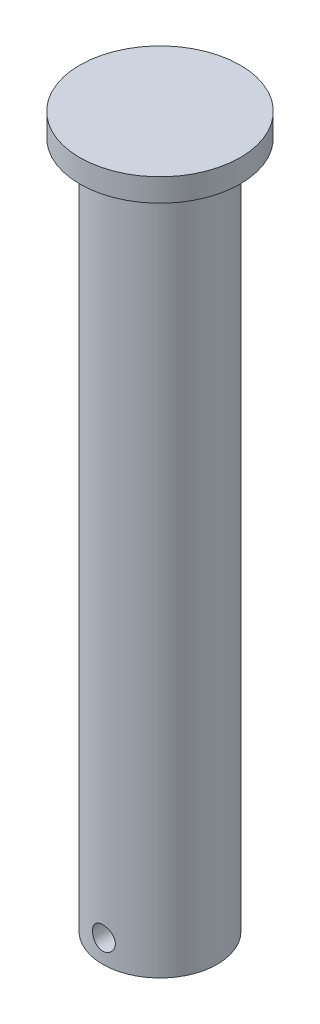
ISO-10303-21;
HEADER;
FILE_DESCRIPTION(('STEP AP214'),'2;1');
FILE_NAME('part.step','',(''),(''),'','','');
FILE_SCHEMA(('AUTOMOTIVE_DESIGN { 1 0 10303 214 1 1 1 1 }'));
ENDSEC;
DATA;
#1=APPLICATION_CONTEXT('core data for automotive mechanical design processes');
#2=APPLICATION_PROTOCOL_DEFINITION('international standard','automotive_design',2000,#1);
#3=PRODUCT_CONTEXT('',#1,'mechanical');
#4=PRODUCT('Part','Part','',(#3));
#5=PRODUCT_RELATED_PRODUCT_CATEGORY('part','',(#4));
#6=PRODUCT_DEFINITION_FORMATION('','',#4);
#7=PRODUCT_DEFINITION_CONTEXT('part definition',#1,'design');
#8=PRODUCT_DEFINITION('design','',#6,#7);
#9=PRODUCT_DEFINITION_SHAPE('','',#8);
#10=(LENGTH_UNIT() NAMED_UNIT(*) SI_UNIT(.MILLI.,.METRE.));
#11=(NAMED_UNIT(*) PLANE_ANGLE_UNIT() SI_UNIT($,.RADIAN.));
#12=(NAMED_UNIT(*) SI_UNIT($,.STERADIAN.) SOLID_ANGLE_UNIT());
#13=UNCERTAINTY_MEASURE_WITH_UNIT(LENGTH_MEASURE(1.E-05),#10,'distance_accuracy_value','');
#14=(GEOMETRIC_REPRESENTATION_CONTEXT(3) GLOBAL_UNCERTAINTY_ASSIGNED_CONTEXT((#13)) GLOBAL_UNIT_ASSIGNED_CONTEXT((#10,
#11,#12)) REPRESENTATION_CONTEXT('',''));
#15=CARTESIAN_POINT('',(0.,0.,0.));
#16=DIRECTION('',(0.,0.,1.));
#17=DIRECTION('',(1.,0.,0.));
#18=AXIS2_PLACEMENT_3D('',#15,#16,#17);
#19=CARTESIAN_POINT('',(0.,60.,0.));
#20=DIRECTION('',(0.,-1.,0.));
#21=DIRECTION('',(0.,0.,-1.));
#22=AXIS2_PLACEMENT_3D('',#19,#20,#21);
#23=CYLINDRICAL_SURFACE('',#22,5.);
#24=CARTESIAN_POINT('',(1.,2.,-4.89897948556636));
#25=CARTESIAN_POINT('',(0.999997945876045,1.94443562451802,-4.89898059043933));
#26=CARTESIAN_POINT('',(0.995353171723656,1.88884537669351,-4.89993508346913));
#27=CARTESIAN_POINT('',(0.976912283588335,1.77923749488159,-4.90364431385263));
#28=CARTESIAN_POINT('',(0.963108847071181,1.72522115536893,-4.90640049166333));
#29=CARTESIAN_POINT('',(0.926795782617738,1.62036269663707,-4.91338873700356));
#30=CARTESIAN_POINT('',(0.904294814152083,1.56951747846507,-4.91761933615313));
#31=CARTESIAN_POINT('',(0.851249107671043,1.47232515530538,-4.92707799486421));
#32=CARTESIAN_POINT('',(0.820704818601296,1.42597779946273,-4.93230599875014));
#33=CARTESIAN_POINT('',(0.75197907565329,1.3384389961455,-4.9432529969268));
#34=CARTESIAN_POINT('',(0.713705655913279,1.29732041211586,-4.94897737836825));
#35=CARTESIAN_POINT('',(0.63080678902135,1.22204246642119,-4.9602247230302));
#36=CARTESIAN_POINT('',(0.586180896977995,1.18788359258285,-4.96574767210945));
#37=CARTESIAN_POINT('',(0.491361355924245,1.12721198237149,-4.97602796417448));
#38=CARTESIAN_POINT('',(0.441122567672207,1.10076848618335,-4.9807782144152));
#39=CARTESIAN_POINT('',(0.336804150387274,1.05672506295188,-4.98891736883662));
#40=CARTESIAN_POINT('',(0.282724881420554,1.03912430809901,-4.99230640044127));
#41=CARTESIAN_POINT('',(0.173016773278494,1.01349280638037,-4.9973032068841));
#42=CARTESIAN_POINT('',(0.117417739214814,1.00533902242899,-4.99893386288125));
#43=CARTESIAN_POINT('',(0.00561856843753665,0.998449048161686,-5.00030921183606));
#44=CARTESIAN_POINT('',(-0.0505815098318429,0.999711950354179,-5.0000540865276));
#45=CARTESIAN_POINT('',(-0.161142000743589,1.01152618021555,-4.99770434868515));
#46=CARTESIAN_POINT('',(-0.21551721429847,1.02194497716785,-4.99563598365838));
#47=CARTESIAN_POINT('',(-0.321731626580301,1.05156503245889,-4.98992177159409));
#48=CARTESIAN_POINT('',(-0.373570723747129,1.07076664219187,-4.98627586144039));
#49=CARTESIAN_POINT('',(-0.473619463200887,1.11753004014727,-4.97777296019958));
#50=CARTESIAN_POINT('',(-0.5218041741339,1.14514375110489,-4.97290848175224));
#51=CARTESIAN_POINT('',(-0.612905045859756,1.2079090772366,-4.96250469473785));
#52=CARTESIAN_POINT('',(-0.655820599525001,1.24306155977052,-4.95696530855222));
#53=CARTESIAN_POINT('',(-0.735951431053457,1.32063362210847,-4.9457096436446));
#54=CARTESIAN_POINT('',(-0.773054316573631,1.36316918672959,-4.93999196457516));
#55=CARTESIAN_POINT('',(-0.839618493176807,1.45391644245075,-4.92911571598761));
#56=CARTESIAN_POINT('',(-0.86907963972775,1.5021282408832,-4.92395715704548));
#57=CARTESIAN_POINT('',(-0.919562814801881,1.60302083182181,-4.91478047472924));
#58=CARTESIAN_POINT('',(-0.940566647777709,1.65571096763966,-4.91076481563549));
#59=CARTESIAN_POINT('',(-0.973390341627582,1.76397132372399,-4.90436476321273));
#60=CARTESIAN_POINT('',(-0.985211399456642,1.81954116761908,-4.90198015728428));
#61=CARTESIAN_POINT('',(-0.999166006036051,1.93096485799904,-4.89915479267828));
#62=CARTESIAN_POINT('',(-1.00146185889791,1.98679757431034,-4.89868147057154));
#63=CARTESIAN_POINT('',(-0.996737628310738,2.09804822319968,-4.89964485688854));
#64=CARTESIAN_POINT('',(-0.989718073122442,2.15346617911886,-4.90108145700388));
#65=CARTESIAN_POINT('',(-0.966702208074157,2.26176864029224,-4.90567232494915));
#66=CARTESIAN_POINT('',(-0.950792620839298,2.31467234303576,-4.90880999014497));
#67=CARTESIAN_POINT('',(-0.910541035308518,2.41706327902874,-4.91643489351665));
#68=CARTESIAN_POINT('',(-0.886198342373177,2.46655023043572,-4.9209222428627));
#69=CARTESIAN_POINT('',(-0.829404142215598,2.56141310995016,-4.93081405962039));
#70=CARTESIAN_POINT('',(-0.796851077982754,2.60672704630083,-4.93622971864903));
#71=CARTESIAN_POINT('',(-0.724695572212712,2.69130831200092,-4.94733723826637));
#72=CARTESIAN_POINT('',(-0.685092405144537,2.73057501824925,-4.95302912723818));
#73=CARTESIAN_POINT('',(-0.599232273497891,2.80256255918558,-4.96415345869216));
#74=CARTESIAN_POINT('',(-0.55288249892963,2.83517365465,-4.96958057708684));
#75=CARTESIAN_POINT('',(-0.455267896634755,2.89214588149958,-4.9794712762862));
#76=CARTESIAN_POINT('',(-0.404003275433507,2.91650735934478,-4.98393489755211));
#77=CARTESIAN_POINT('',(-0.298302680824013,2.95612887174663,-4.99137294061067));
#78=CARTESIAN_POINT('',(-0.243886673478077,2.97144051822625,-4.99435579142604));
#79=CARTESIAN_POINT('',(-0.133189454679912,2.99269124766385,-4.9985323593766));
#80=CARTESIAN_POINT('',(-0.0769084687112141,2.99863145947568,-4.99972629199843));
#81=CARTESIAN_POINT('',(0.0348728939036234,3.00092698096289,-5.00018540454121));
#82=CARTESIAN_POINT('',(0.0903698121415025,2.99744728045621,-4.99948378549351));
#83=CARTESIAN_POINT('',(0.199971031315642,2.98136604945219,-4.99630043560318));
#84=CARTESIAN_POINT('',(0.254075349753691,2.96876463365193,-4.99381872714351));
#85=CARTESIAN_POINT('',(0.359252749745096,2.93487100790836,-4.98735498365001));
#86=CARTESIAN_POINT('',(0.410332443240281,2.91359862186882,-4.98337637247912));
#87=CARTESIAN_POINT('',(0.508221220185953,2.8629877586691,-4.97434722123382));
#88=CARTESIAN_POINT('',(0.555029965767411,2.83364864409628,-4.96929659645878));
#89=CARTESIAN_POINT('',(0.643863890106357,2.76718061293792,-4.95857599157869));
#90=CARTESIAN_POINT('',(0.685799716116503,2.72993366361323,-4.95289733422142));
#91=CARTESIAN_POINT('',(0.762882617756846,2.64894975990423,-4.94161222903622));
#92=CARTESIAN_POINT('',(0.798028083202712,2.60521127053126,-4.93600579862875));
#93=CARTESIAN_POINT('',(0.8608922194552,2.51192068329982,-4.92543342749964));
#94=CARTESIAN_POINT('',(0.888526814639767,2.46231103883963,-4.92047503631328));
#95=CARTESIAN_POINT('',(0.935024049287808,2.35906722670031,-4.91185237184445));
#96=CARTESIAN_POINT('',(0.95389464597929,2.30543676130208,-4.90818692536957));
#97=CARTESIAN_POINT('',(0.978669139854273,2.20973754456343,-4.90329681128922));
#98=CARTESIAN_POINT('',(0.986653898522986,2.16821458048854,-4.90168784915661));
#99=CARTESIAN_POINT('',(0.997320017960409,2.08446604544636,-4.8995287845803));
#100=CARTESIAN_POINT('',(1.00000156156205,2.04224049875183,-4.89897864563277));
#101=CARTESIAN_POINT('',(1.,2.,-4.89897948556636));
#102=B_SPLINE_CURVE_WITH_KNOTS('',3,(#24,#25,#26,#27,#28,#29,#30,#31,#32,#33,#34,#35,#36,#37,
#38,#39,#40,#41,#42,#43,#44,#45,#46,#47,#48,#49,#50,#51,#52,#53,#54,#55,#56,#57,#58,#59,#60,#61,
#62,#63,#64,#65,#66,#67,#68,#69,#70,#71,#72,#73,#74,#75,#76,#77,#78,#79,#80,#81,#82,#83,#84,#85,
#86,#87,#88,#89,#90,#91,#92,#93,#94,#95,#96,#97,#98,#99,#100,#101),.UNSPECIFIED.,.T.,.F.,(4,2,2,
2,2,2,2,2,2,2,2,2,2,2,2,2,2,2,2,2,2,2,2,2,2,2,2,2,2,2,2,2,2,2,2,2,2,2,4),(0.,0.166538463856524,
0.333210239259264,0.499716497915553,0.666213464834831,0.834822525459335,1.00344340032919,
1.17353400434947,1.34360868244057,1.51144248880577,1.67926012113745,1.84468789631034,
2.01012229071247,2.176599242198,2.34309535767563,2.5124934675998,2.68189478120217,
2.85165863170273,3.02140035013522,3.1882375780209,3.35506534525918,3.52029341780816,
3.68553510351895,3.85293059772018,4.02034332867706,4.19032601730947,4.36030156627601,
4.52929813576147,4.69827434689125,4.86431017412183,5.03034391364253,5.19600017072949,
5.36166952132181,5.53001152023093,5.69839338887278,5.86858898576538,6.03862975086429,
6.16523803634393,6.29184195681711),.UNSPECIFIED.);
#103=CARTESIAN_POINT('',(1.,2.,-4.89897948556636));
#104=VERTEX_POINT('',#103);
#105=EDGE_CURVE('E65',#104,#104,#102,.T.);
#106=ORIENTED_EDGE('',*,*,#105,.F.);
#107=EDGE_LOOP('',(#106));
#108=FACE_BOUND('',#107,.T.);
#109=CARTESIAN_POINT('',(1.,2.,4.89897948556636));
#110=CARTESIAN_POINT('',(0.999997945876045,1.94443562451802,4.89898059043933));
#111=CARTESIAN_POINT('',(0.995353171723656,1.88884537669351,4.89993508346913));
#112=CARTESIAN_POINT('',(0.976912283588335,1.77923749488159,4.90364431385263));
#113=CARTESIAN_POINT('',(0.963108847071181,1.72522115536893,4.90640049166333));
#114=CARTESIAN_POINT('',(0.926795782617738,1.62036269663707,4.91338873700356));
#115=CARTESIAN_POINT('',(0.904294814152083,1.56951747846507,4.91761933615313));
#116=CARTESIAN_POINT('',(0.851249107671043,1.47232515530538,4.92707799486421));
#117=CARTESIAN_POINT('',(0.820704818601296,1.42597779946273,4.93230599875014));
#118=CARTESIAN_POINT('',(0.75197907565329,1.3384389961455,4.9432529969268));
#119=CARTESIAN_POINT('',(0.713705655913279,1.29732041211586,4.94897737836825));
#120=CARTESIAN_POINT('',(0.63080678902135,1.22204246642119,4.9602247230302));
#121=CARTESIAN_POINT('',(0.586180896977995,1.18788359258285,4.96574767210945));
#122=CARTESIAN_POINT('',(0.491361355924245,1.12721198237149,4.97602796417448));
#123=CARTESIAN_POINT('',(0.441122567672207,1.10076848618335,4.9807782144152));
#124=CARTESIAN_POINT('',(0.336804150387274,1.05672506295188,4.98891736883662));
#125=CARTESIAN_POINT('',(0.282724881420554,1.03912430809901,4.99230640044127));
#126=CARTESIAN_POINT('',(0.173016773278494,1.01349280638037,4.9973032068841));
#127=CARTESIAN_POINT('',(0.117417739214814,1.00533902242899,4.99893386288125));
#128=CARTESIAN_POINT('',(0.00561856843753665,0.998449048161686,5.00030921183606));
#129=CARTESIAN_POINT('',(-0.0505815098318429,0.999711950354179,5.0000540865276));
#130=CARTESIAN_POINT('',(-0.161142000743589,1.01152618021555,4.99770434868515));
#131=CARTESIAN_POINT('',(-0.21551721429847,1.02194497716785,4.99563598365838));
#132=CARTESIAN_POINT('',(-0.321731626580301,1.05156503245889,4.98992177159409));
#133=CARTESIAN_POINT('',(-0.373570723747129,1.07076664219187,4.98627586144039));
#134=CARTESIAN_POINT('',(-0.473619463200887,1.11753004014727,4.97777296019958));
#135=CARTESIAN_POINT('',(-0.5218041741339,1.14514375110489,4.97290848175224));
#136=CARTESIAN_POINT('',(-0.612905045859756,1.2079090772366,4.96250469473785));
#137=CARTESIAN_POINT('',(-0.655820599525001,1.24306155977052,4.95696530855222));
#138=CARTESIAN_POINT('',(-0.735951431053457,1.32063362210847,4.9457096436446));
#139=CARTESIAN_POINT('',(-0.773054316573631,1.36316918672959,4.93999196457516));
#140=CARTESIAN_POINT('',(-0.839618493176807,1.45391644245075,4.92911571598761));
#141=CARTESIAN_POINT('',(-0.86907963972775,1.5021282408832,4.92395715704548));
#142=CARTESIAN_POINT('',(-0.919562814801881,1.60302083182181,4.91478047472924));
#143=CARTESIAN_POINT('',(-0.940566647777709,1.65571096763966,4.91076481563549));
#144=CARTESIAN_POINT('',(-0.973390341627582,1.76397132372399,4.90436476321273));
#145=CARTESIAN_POINT('',(-0.985211399456642,1.81954116761908,4.90198015728428));
#146=CARTESIAN_POINT('',(-0.999166006036051,1.93096485799904,4.89915479267828));
#147=CARTESIAN_POINT('',(-1.00146185889791,1.98679757431034,4.89868147057154));
#148=CARTESIAN_POINT('',(-0.996737628310738,2.09804822319968,4.89964485688854));
#149=CARTESIAN_POINT('',(-0.989718073122442,2.15346617911886,4.90108145700388));
#150=CARTESIAN_POINT('',(-0.966702208074157,2.26176864029224,4.90567232494915));
#151=CARTESIAN_POINT('',(-0.950792620839298,2.31467234303576,4.90880999014497));
#152=CARTESIAN_POINT('',(-0.910541035308518,2.41706327902874,4.91643489351665));
#153=CARTESIAN_POINT('',(-0.886198342373177,2.46655023043572,4.9209222428627));
#154=CARTESIAN_POINT('',(-0.829404142215598,2.56141310995016,4.93081405962039));
#155=CARTESIAN_POINT('',(-0.796851077982754,2.60672704630083,4.93622971864903));
#156=CARTESIAN_POINT('',(-0.724695572212712,2.69130831200092,4.94733723826637));
#157=CARTESIAN_POINT('',(-0.685092405144537,2.73057501824925,4.95302912723818));
#158=CARTESIAN_POINT('',(-0.599232273497891,2.80256255918558,4.96415345869216));
#159=CARTESIAN_POINT('',(-0.55288249892963,2.83517365465,4.96958057708684));
#160=CARTESIAN_POINT('',(-0.455267896634755,2.89214588149958,4.9794712762862));
#161=CARTESIAN_POINT('',(-0.404003275433507,2.91650735934478,4.98393489755211));
#162=CARTESIAN_POINT('',(-0.298302680824013,2.95612887174663,4.99137294061067));
#163=CARTESIAN_POINT('',(-0.243886673478077,2.97144051822625,4.99435579142604));
#164=CARTESIAN_POINT('',(-0.133189454679912,2.99269124766385,4.9985323593766));
#165=CARTESIAN_POINT('',(-0.0769084687112141,2.99863145947568,4.99972629199843));
#166=CARTESIAN_POINT('',(0.0348728939036234,3.00092698096289,5.00018540454121));
#167=CARTESIAN_POINT('',(0.0903698121415025,2.99744728045621,4.99948378549351));
#168=CARTESIAN_POINT('',(0.199971031315642,2.98136604945219,4.99630043560318));
#169=CARTESIAN_POINT('',(0.254075349753691,2.96876463365193,4.99381872714351));
#170=CARTESIAN_POINT('',(0.359252749745096,2.93487100790836,4.98735498365001));
#171=CARTESIAN_POINT('',(0.410332443240281,2.91359862186882,4.98337637247912));
#172=CARTESIAN_POINT('',(0.508221220185953,2.8629877586691,4.97434722123382));
#173=CARTESIAN_POINT('',(0.555029965767411,2.83364864409628,4.96929659645878));
#174=CARTESIAN_POINT('',(0.643863890106357,2.76718061293792,4.95857599157869));
#175=CARTESIAN_POINT('',(0.685799716116503,2.72993366361323,4.95289733422142));
#176=CARTESIAN_POINT('',(0.762882617756846,2.64894975990423,4.94161222903622));
#177=CARTESIAN_POINT('',(0.798028083202712,2.60521127053126,4.93600579862875));
#178=CARTESIAN_POINT('',(0.8608922194552,2.51192068329982,4.92543342749964));
#179=CARTESIAN_POINT('',(0.888526814639767,2.46231103883963,4.92047503631328));
#180=CARTESIAN_POINT('',(0.935024049287808,2.35906722670031,4.91185237184445));
#181=CARTESIAN_POINT('',(0.95389464597929,2.30543676130208,4.90818692536957));
#182=CARTESIAN_POINT('',(0.978669139854273,2.20973754456343,4.90329681128922));
#183=CARTESIAN_POINT('',(0.986653898522986,2.16821458048854,4.90168784915661));
#184=CARTESIAN_POINT('',(0.997320017960409,2.08446604544636,4.8995287845803));
#185=CARTESIAN_POINT('',(1.00000156156205,2.04224049875183,4.89897864563277));
#186=CARTESIAN_POINT('',(1.,2.,4.89897948556636));
#187=B_SPLINE_CURVE_WITH_KNOTS('',3,(#109,#110,#111,#112,#113,#114,#115,#116,#117,#118,#119,
#120,#121,#122,#123,#124,#125,#126,#127,#128,#129,#130,#131,#132,#133,#134,#135,#136,#137,#138,
#139,#140,#141,#142,#143,#144,#145,#146,#147,#148,#149,#150,#151,#152,#153,#154,#155,#156,#157,
#158,#159,#160,#161,#162,#163,#164,#165,#166,#167,#168,#169,#170,#171,#172,#173,#174,#175,#176,
#177,#178,#179,#180,#181,#182,#183,#184,#185,#186),.UNSPECIFIED.,.T.,.F.,(4,2,2,2,2,2,2,2,2,2,2,
2,2,2,2,2,2,2,2,2,2,2,2,2,2,2,2,2,2,2,2,2,2,2,2,2,2,2,4),(0.,0.166538463856524,
0.333210239259264,0.499716497915553,0.666213464834831,0.834822525459335,1.00344340032919,
1.17353400434947,1.34360868244057,1.51144248880577,1.67926012113745,1.84468789631034,
2.01012229071247,2.176599242198,2.34309535767563,2.5124934675998,2.68189478120217,
2.85165863170273,3.02140035013522,3.1882375780209,3.35506534525918,3.52029341780816,
3.68553510351895,3.85293059772018,4.02034332867706,4.19032601730947,4.36030156627601,
4.52929813576147,4.69827434689125,4.86431017412183,5.03034391364253,5.19600017072949,
5.36166952132181,5.53001152023093,5.69839338887278,5.86858898576538,6.03862975086429,
6.16523803634393,6.29184195681711),.UNSPECIFIED.);
#188=CARTESIAN_POINT('',(1.,2.,4.89897948556636));
#189=VERTEX_POINT('',#188);
#190=EDGE_CURVE('E41',#189,#189,#187,.T.);
#191=ORIENTED_EDGE('',*,*,#190,.T.);
#192=EDGE_LOOP('',(#191));
#193=FACE_BOUND('',#192,.T.);
#194=CARTESIAN_POINT('',(0.,60.,0.));
#195=DIRECTION('',(0.,1.,0.));
#196=DIRECTION('',(0.,0.,1.));
#197=AXIS2_PLACEMENT_3D('',#194,#195,#196);
#198=CIRCLE('',#197,5.);
#199=CARTESIAN_POINT('',(0.,60.,5.));
#200=VERTEX_POINT('',#199);
#201=EDGE_CURVE('E10',#200,#200,#198,.T.);
#202=ORIENTED_EDGE('',*,*,#201,.F.);
#203=EDGE_LOOP('',(#202));
#204=FACE_BOUND('',#203,.T.);
#205=CARTESIAN_POINT('',(0.,0.,0.));
#206=DIRECTION('',(0.,1.,0.));
#207=DIRECTION('',(0.,0.,1.));
#208=AXIS2_PLACEMENT_3D('',#205,#206,#207);
#209=CIRCLE('',#208,5.);
#210=CARTESIAN_POINT('',(0.,0.,5.));
#211=VERTEX_POINT('',#210);
#212=EDGE_CURVE('E50',#211,#211,#209,.T.);
#213=ORIENTED_EDGE('',*,*,#212,.T.);
#214=EDGE_LOOP('',(#213));
#215=FACE_BOUND('',#214,.T.);
#216=ADVANCED_FACE('F37',(#108,#193,#204,#215),#23,.T.);
#217=CARTESIAN_POINT('',(0.,0.,0.));
#218=DIRECTION('',(0.,1.,0.));
#219=DIRECTION('',(0.,0.,1.));
#220=AXIS2_PLACEMENT_3D('',#217,#218,#219);
#221=PLANE('',#220);
#222=ORIENTED_EDGE('',*,*,#212,.F.);
#223=EDGE_LOOP('',(#222));
#224=FACE_BOUND('',#223,.T.);
#225=ADVANCED_FACE('F88',(#224),#221,.F.);
#226=CARTESIAN_POINT('',(0.,62.,0.));
#227=DIRECTION('',(0.,-1.,0.));
#228=DIRECTION('',(0.,0.,-1.));
#229=AXIS2_PLACEMENT_3D('',#226,#227,#228);
#230=CYLINDRICAL_SURFACE('',#229,7.);
#231=CARTESIAN_POINT('',(0.,62.,0.));
#232=DIRECTION('',(0.,1.,0.));
#233=DIRECTION('',(0.,0.,1.));
#234=AXIS2_PLACEMENT_3D('',#231,#232,#233);
#235=CIRCLE('',#234,7.);
#236=CARTESIAN_POINT('',(0.,62.,7.));
#237=VERTEX_POINT('',#236);
#238=EDGE_CURVE('E56',#237,#237,#235,.T.);
#239=ORIENTED_EDGE('',*,*,#238,.F.);
#240=EDGE_LOOP('',(#239));
#241=FACE_BOUND('',#240,.T.);
#242=CARTESIAN_POINT('',(0.,60.,0.));
#243=DIRECTION('',(0.,1.,0.));
#244=DIRECTION('',(0.,0.,1.));
#245=AXIS2_PLACEMENT_3D('',#242,#243,#244);
#246=CIRCLE('',#245,7.);
#247=CARTESIAN_POINT('',(0.,60.,7.));
#248=VERTEX_POINT('',#247);
#249=EDGE_CURVE('E58',#248,#248,#246,.T.);
#250=ORIENTED_EDGE('',*,*,#249,.T.);
#251=EDGE_LOOP('',(#250));
#252=FACE_BOUND('',#251,.T.);
#253=ADVANCED_FACE('F83',(#241,#252),#230,.T.);
#254=CARTESIAN_POINT('',(0.,62.,0.));
#255=DIRECTION('',(0.,1.,0.));
#256=DIRECTION('',(0.,0.,1.));
#257=AXIS2_PLACEMENT_3D('',#254,#255,#256);
#258=PLANE('',#257);
#259=ORIENTED_EDGE('',*,*,#238,.T.);
#260=EDGE_LOOP('',(#259));
#261=FACE_BOUND('',#260,.T.);
#262=ADVANCED_FACE('F79',(#261),#258,.T.);
#263=CARTESIAN_POINT('',(0.,60.,0.));
#264=DIRECTION('',(0.,1.,0.));
#265=DIRECTION('',(0.,0.,1.));
#266=AXIS2_PLACEMENT_3D('',#263,#264,#265);
#267=PLANE('',#266);
#268=ORIENTED_EDGE('',*,*,#201,.T.);
#269=EDGE_LOOP('',(#268));
#270=FACE_BOUND('',#269,.T.);
#271=ORIENTED_EDGE('',*,*,#249,.F.);
#272=EDGE_LOOP('',(#271));
#273=FACE_BOUND('',#272,.T.);
#274=ADVANCED_FACE('F77',(#270,#273),#267,.F.);
#275=CARTESIAN_POINT('',(0.,2.,-7.002));
#276=DIRECTION('',(0.,0.,1.));
#277=DIRECTION('',(1.,0.,0.));
#278=AXIS2_PLACEMENT_3D('',#275,#276,#277);
#279=CYLINDRICAL_SURFACE('',#278,1.);
#280=ORIENTED_EDGE('',*,*,#105,.T.);
#281=EDGE_LOOP('',(#280));
#282=FACE_BOUND('',#281,.T.);
#283=ORIENTED_EDGE('',*,*,#190,.F.);
#284=EDGE_LOOP('',(#283));
#285=FACE_BOUND('',#284,.T.);
#286=ADVANCED_FACE('F72',(#282,#285),#279,.F.);
#287=CLOSED_SHELL('',(#216,#225,#253,#262,#274,#286));
#288=MANIFOLD_SOLID_BREP('B2',#287);
#289=ADVANCED_BREP_SHAPE_REPRESENTATION('',(#18,#288),#14);
#290=SHAPE_DEFINITION_REPRESENTATION(#9,#289);
ENDSEC;
END-ISO-10303-21;
